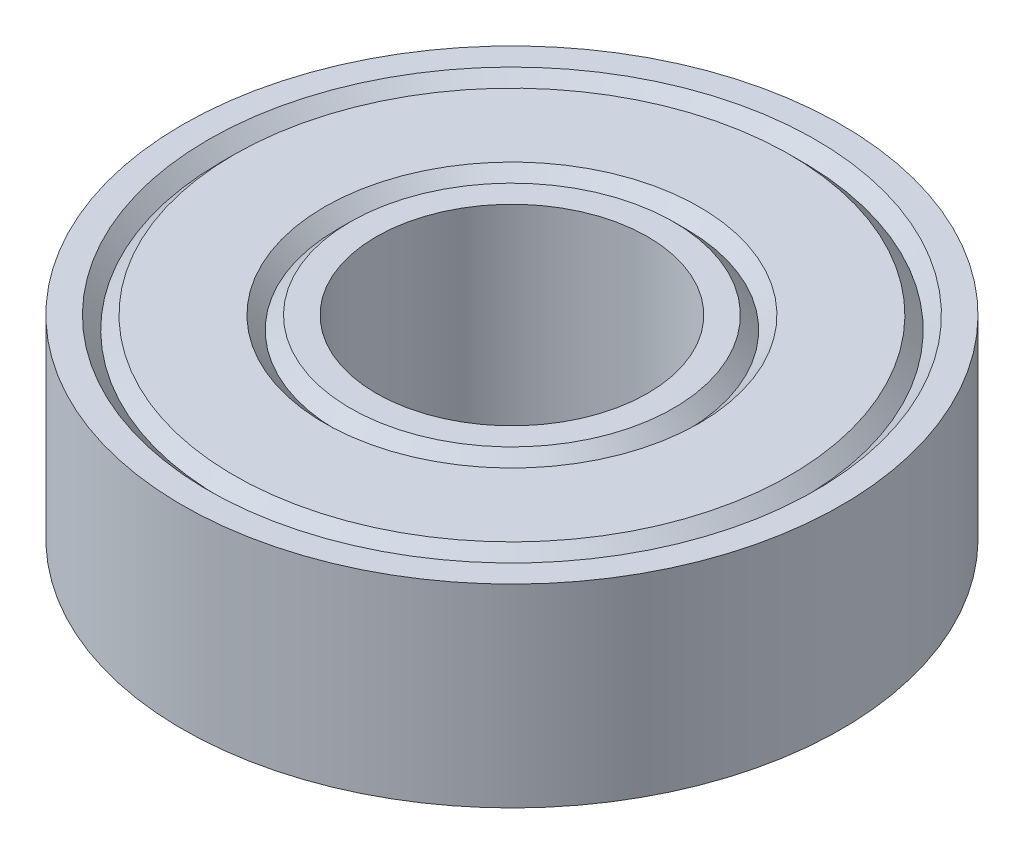
ISO-10303-21;
HEADER;
FILE_DESCRIPTION(('STEP AP214'),'2;1');
FILE_NAME('part.step','',(''),(''),'','','');
FILE_SCHEMA(('AUTOMOTIVE_DESIGN { 1 0 10303 214 1 1 1 1 }'));
ENDSEC;
DATA;
#1=APPLICATION_CONTEXT('core data for automotive mechanical design processes');
#2=APPLICATION_PROTOCOL_DEFINITION('international standard','automotive_design',2000,#1);
#3=PRODUCT_CONTEXT('',#1,'mechanical');
#4=PRODUCT('Part','Part','',(#3));
#5=PRODUCT_RELATED_PRODUCT_CATEGORY('part','',(#4));
#6=PRODUCT_DEFINITION_FORMATION('','',#4);
#7=PRODUCT_DEFINITION_CONTEXT('part definition',#1,'design');
#8=PRODUCT_DEFINITION('design','',#6,#7);
#9=PRODUCT_DEFINITION_SHAPE('','',#8);
#10=(LENGTH_UNIT() NAMED_UNIT(*) SI_UNIT(.MILLI.,.METRE.));
#11=(NAMED_UNIT(*) PLANE_ANGLE_UNIT() SI_UNIT($,.RADIAN.));
#12=(NAMED_UNIT(*) SI_UNIT($,.STERADIAN.) SOLID_ANGLE_UNIT());
#13=UNCERTAINTY_MEASURE_WITH_UNIT(LENGTH_MEASURE(1.E-05),#10,'distance_accuracy_value','');
#14=(GEOMETRIC_REPRESENTATION_CONTEXT(3) GLOBAL_UNCERTAINTY_ASSIGNED_CONTEXT((#13)) GLOBAL_UNIT_ASSIGNED_CONTEXT((#10,
#11,#12)) REPRESENTATION_CONTEXT('',''));
#15=CARTESIAN_POINT('',(0.,0.,0.));
#16=DIRECTION('',(0.,0.,1.));
#17=DIRECTION('',(1.,0.,0.));
#18=AXIS2_PLACEMENT_3D('',#15,#16,#17);
#19=CARTESIAN_POINT('',(0.,2.5,0.));
#20=DIRECTION('',(0.,1.,0.));
#21=DIRECTION('',(-1.,0.,0.));
#22=AXIS2_PLACEMENT_3D('',#19,#20,#21);
#23=CYLINDRICAL_SURFACE('',#22,3.5);
#24=CARTESIAN_POINT('',(0.,2.49999999999999,0.));
#25=DIRECTION('',(0.,1.,0.));
#26=DIRECTION('',(-1.,0.,0.));
#27=AXIS2_PLACEMENT_3D('',#24,#25,#26);
#28=CIRCLE('',#27,3.5);
#29=CARTESIAN_POINT('',(-3.5,2.49999999999999,0.));
#30=VERTEX_POINT('',#29);
#31=EDGE_CURVE('E83',#30,#30,#28,.T.);
#32=ORIENTED_EDGE('',*,*,#31,.T.);
#33=EDGE_LOOP('',(#32));
#34=FACE_BOUND('',#33,.T.);
#35=CARTESIAN_POINT('',(0.,-2.49999999999999,0.));
#36=DIRECTION('',(0.,1.,0.));
#37=DIRECTION('',(-1.,0.,0.));
#38=AXIS2_PLACEMENT_3D('',#35,#36,#37);
#39=CIRCLE('',#38,3.5);
#40=CARTESIAN_POINT('',(-3.5,-2.49999999999999,0.));
#41=VERTEX_POINT('',#40);
#42=EDGE_CURVE('E10',#41,#41,#39,.T.);
#43=ORIENTED_EDGE('',*,*,#42,.F.);
#44=EDGE_LOOP('',(#43));
#45=FACE_BOUND('',#44,.T.);
#46=ADVANCED_FACE('F31',(#34,#45),#23,.F.);
#47=CARTESIAN_POINT('',(-3.5,-2.5,0.));
#48=DIRECTION('',(0.,-1.,0.));
#49=DIRECTION('',(1.,0.,0.));
#50=AXIS2_PLACEMENT_3D('',#47,#48,#49);
#51=PLANE('',#50);
#52=ORIENTED_EDGE('',*,*,#42,.T.);
#53=EDGE_LOOP('',(#52));
#54=FACE_BOUND('',#53,.T.);
#55=CARTESIAN_POINT('',(0.,-2.5,0.));
#56=DIRECTION('',(0.,1.,0.));
#57=DIRECTION('',(-1.,0.,0.));
#58=AXIS2_PLACEMENT_3D('',#55,#56,#57);
#59=CIRCLE('',#58,4.16666666666667);
#60=CARTESIAN_POINT('',(-4.16666666666667,-2.5,0.));
#61=VERTEX_POINT('',#60);
#62=EDGE_CURVE('E37',#61,#61,#59,.T.);
#63=ORIENTED_EDGE('',*,*,#62,.F.);
#64=EDGE_LOOP('',(#63));
#65=FACE_BOUND('',#64,.T.);
#66=ADVANCED_FACE('F101',(#54,#65),#51,.T.);
#67=CARTESIAN_POINT('',(0.,-2.16666666666667,0.));
#68=DIRECTION('',(0.,1.,0.));
#69=DIRECTION('',(-1.,0.,0.));
#70=AXIS2_PLACEMENT_3D('',#67,#68,#69);
#71=CONICAL_SURFACE('',#70,4.50000000000001,0.785398163397448);
#72=ORIENTED_EDGE('',*,*,#62,.T.);
#73=EDGE_LOOP('',(#72));
#74=FACE_BOUND('',#73,.T.);
#75=CARTESIAN_POINT('',(0.,-2.16666666666667,0.));
#76=DIRECTION('',(0.,1.,0.));
#77=DIRECTION('',(-1.,0.,0.));
#78=AXIS2_PLACEMENT_3D('',#75,#76,#77);
#79=CIRCLE('',#78,4.50000000000001);
#80=CARTESIAN_POINT('',(-4.50000000000001,-2.16666666666666,0.));
#81=VERTEX_POINT('',#80);
#82=EDGE_CURVE('E41',#81,#81,#79,.T.);
#83=ORIENTED_EDGE('',*,*,#82,.F.);
#84=EDGE_LOOP('',(#83));
#85=FACE_BOUND('',#84,.T.);
#86=ADVANCED_FACE('F105',(#74,#85),#71,.T.);
#87=CARTESIAN_POINT('',(0.,-2.5,0.));
#88=DIRECTION('',(0.,-1.,0.));
#89=DIRECTION('',(1.,0.,0.));
#90=AXIS2_PLACEMENT_3D('',#87,#88,#89);
#91=CONICAL_SURFACE('',#90,4.83333333333334,0.78539816339745);
#92=ORIENTED_EDGE('',*,*,#82,.T.);
#93=EDGE_LOOP('',(#92));
#94=FACE_BOUND('',#93,.T.);
#95=CARTESIAN_POINT('',(0.,-2.5,0.));
#96=DIRECTION('',(0.,1.,0.));
#97=DIRECTION('',(-1.,0.,0.));
#98=AXIS2_PLACEMENT_3D('',#95,#96,#97);
#99=CIRCLE('',#98,4.83333333333334);
#100=CARTESIAN_POINT('',(-4.83333333333334,-2.5,0.));
#101=VERTEX_POINT('',#100);
#102=EDGE_CURVE('E45',#101,#101,#99,.T.);
#103=ORIENTED_EDGE('',*,*,#102,.F.);
#104=EDGE_LOOP('',(#103));
#105=FACE_BOUND('',#104,.T.);
#106=ADVANCED_FACE('F109',(#94,#105),#91,.F.);
#107=CARTESIAN_POINT('',(-4.83333333333334,-2.5,0.));
#108=DIRECTION('',(0.,-1.,0.));
#109=DIRECTION('',(1.,0.,0.));
#110=AXIS2_PLACEMENT_3D('',#107,#108,#109);
#111=PLANE('',#110);
#112=ORIENTED_EDGE('',*,*,#102,.T.);
#113=EDGE_LOOP('',(#112));
#114=FACE_BOUND('',#113,.T.);
#115=CARTESIAN_POINT('',(0.,-2.50000000000001,0.));
#116=DIRECTION('',(0.,1.,0.));
#117=DIRECTION('',(-1.,0.,0.));
#118=AXIS2_PLACEMENT_3D('',#115,#116,#117);
#119=CIRCLE('',#118,7.16666666666666);
#120=CARTESIAN_POINT('',(-7.16666666666666,-2.5,0.));
#121=VERTEX_POINT('',#120);
#122=EDGE_CURVE('E50',#121,#121,#119,.T.);
#123=ORIENTED_EDGE('',*,*,#122,.F.);
#124=EDGE_LOOP('',(#123));
#125=FACE_BOUND('',#124,.T.);
#126=ADVANCED_FACE('F115',(#114,#125),#111,.T.);
#127=CARTESIAN_POINT('',(0.,-2.16666666666667,0.));
#128=DIRECTION('',(0.,1.,0.));
#129=DIRECTION('',(-1.,0.,0.));
#130=AXIS2_PLACEMENT_3D('',#127,#128,#129);
#131=CONICAL_SURFACE('',#130,7.5,0.785398163397455);
#132=ORIENTED_EDGE('',*,*,#122,.T.);
#133=EDGE_LOOP('',(#132));
#134=FACE_BOUND('',#133,.T.);
#135=CARTESIAN_POINT('',(0.,-2.16666666666667,0.));
#136=DIRECTION('',(0.,1.,0.));
#137=DIRECTION('',(-1.,0.,0.));
#138=AXIS2_PLACEMENT_3D('',#135,#136,#137);
#139=CIRCLE('',#138,7.5);
#140=CARTESIAN_POINT('',(-7.5,-2.16666666666666,0.));
#141=VERTEX_POINT('',#140);
#142=EDGE_CURVE('E53',#141,#141,#139,.T.);
#143=ORIENTED_EDGE('',*,*,#142,.F.);
#144=EDGE_LOOP('',(#143));
#145=FACE_BOUND('',#144,.T.);
#146=ADVANCED_FACE('F119',(#134,#145),#131,.T.);
#147=CARTESIAN_POINT('',(0.,-2.5,0.));
#148=DIRECTION('',(0.,-1.,0.));
#149=DIRECTION('',(1.,0.,0.));
#150=AXIS2_PLACEMENT_3D('',#147,#148,#149);
#151=CONICAL_SURFACE('',#150,7.83333333333333,0.785398163397446);
#152=ORIENTED_EDGE('',*,*,#142,.T.);
#153=EDGE_LOOP('',(#152));
#154=FACE_BOUND('',#153,.T.);
#155=CARTESIAN_POINT('',(0.,-2.5,0.));
#156=DIRECTION('',(0.,1.,0.));
#157=DIRECTION('',(-1.,0.,0.));
#158=AXIS2_PLACEMENT_3D('',#155,#156,#157);
#159=CIRCLE('',#158,7.83333333333334);
#160=CARTESIAN_POINT('',(-7.83333333333334,-2.5,0.));
#161=VERTEX_POINT('',#160);
#162=EDGE_CURVE('E56',#161,#161,#159,.T.);
#163=ORIENTED_EDGE('',*,*,#162,.F.);
#164=EDGE_LOOP('',(#163));
#165=FACE_BOUND('',#164,.T.);
#166=ADVANCED_FACE('F123',(#154,#165),#151,.F.);
#167=CARTESIAN_POINT('',(-7.83333333333334,-2.5,0.));
#168=DIRECTION('',(0.,-1.,0.));
#169=DIRECTION('',(1.,0.,0.));
#170=AXIS2_PLACEMENT_3D('',#167,#168,#169);
#171=PLANE('',#170);
#172=ORIENTED_EDGE('',*,*,#162,.T.);
#173=EDGE_LOOP('',(#172));
#174=FACE_BOUND('',#173,.T.);
#175=CARTESIAN_POINT('',(0.,-2.5,0.));
#176=DIRECTION('',(0.,1.,0.));
#177=DIRECTION('',(-1.,0.,0.));
#178=AXIS2_PLACEMENT_3D('',#175,#176,#177);
#179=CIRCLE('',#178,8.5);
#180=CARTESIAN_POINT('',(-8.5,-2.5,0.));
#181=VERTEX_POINT('',#180);
#182=EDGE_CURVE('E59',#181,#181,#179,.T.);
#183=ORIENTED_EDGE('',*,*,#182,.F.);
#184=EDGE_LOOP('',(#183));
#185=FACE_BOUND('',#184,.T.);
#186=ADVANCED_FACE('F127',(#174,#185),#171,.T.);
#187=CARTESIAN_POINT('',(0.,2.5,0.));
#188=DIRECTION('',(0.,1.,0.));
#189=DIRECTION('',(-1.,0.,0.));
#190=AXIS2_PLACEMENT_3D('',#187,#188,#189);
#191=CYLINDRICAL_SURFACE('',#190,8.5);
#192=ORIENTED_EDGE('',*,*,#182,.T.);
#193=EDGE_LOOP('',(#192));
#194=FACE_BOUND('',#193,.T.);
#195=CARTESIAN_POINT('',(0.,2.5,0.));
#196=DIRECTION('',(0.,1.,0.));
#197=DIRECTION('',(-1.,0.,0.));
#198=AXIS2_PLACEMENT_3D('',#195,#196,#197);
#199=CIRCLE('',#198,8.5);
#200=CARTESIAN_POINT('',(-8.5,2.5,0.));
#201=VERTEX_POINT('',#200);
#202=EDGE_CURVE('E62',#201,#201,#199,.T.);
#203=ORIENTED_EDGE('',*,*,#202,.F.);
#204=EDGE_LOOP('',(#203));
#205=FACE_BOUND('',#204,.T.);
#206=ADVANCED_FACE('F131',(#194,#205),#191,.T.);
#207=CARTESIAN_POINT('',(-7.83333333333334,2.5,0.));
#208=DIRECTION('',(0.,1.,0.));
#209=DIRECTION('',(-1.,0.,0.));
#210=AXIS2_PLACEMENT_3D('',#207,#208,#209);
#211=PLANE('',#210);
#212=ORIENTED_EDGE('',*,*,#202,.T.);
#213=EDGE_LOOP('',(#212));
#214=FACE_BOUND('',#213,.T.);
#215=CARTESIAN_POINT('',(0.,2.5,0.));
#216=DIRECTION('',(0.,1.,0.));
#217=DIRECTION('',(-1.,0.,0.));
#218=AXIS2_PLACEMENT_3D('',#215,#216,#217);
#219=CIRCLE('',#218,7.83333333333334);
#220=CARTESIAN_POINT('',(-7.83333333333334,2.5,0.));
#221=VERTEX_POINT('',#220);
#222=EDGE_CURVE('E65',#221,#221,#219,.T.);
#223=ORIENTED_EDGE('',*,*,#222,.F.);
#224=EDGE_LOOP('',(#223));
#225=FACE_BOUND('',#224,.T.);
#226=ADVANCED_FACE('F135',(#214,#225),#211,.T.);
#227=CARTESIAN_POINT('',(0.,2.16666666666666,0.));
#228=DIRECTION('',(0.,1.,0.));
#229=DIRECTION('',(-1.,0.,0.));
#230=AXIS2_PLACEMENT_3D('',#227,#228,#229);
#231=CONICAL_SURFACE('',#230,7.5,0.785398163397452);
#232=ORIENTED_EDGE('',*,*,#222,.T.);
#233=EDGE_LOOP('',(#232));
#234=FACE_BOUND('',#233,.T.);
#235=CARTESIAN_POINT('',(0.,2.16666666666666,0.));
#236=DIRECTION('',(0.,1.,0.));
#237=DIRECTION('',(-1.,0.,0.));
#238=AXIS2_PLACEMENT_3D('',#235,#236,#237);
#239=CIRCLE('',#238,7.5);
#240=CARTESIAN_POINT('',(-7.5,2.16666666666666,0.));
#241=VERTEX_POINT('',#240);
#242=EDGE_CURVE('E68',#241,#241,#239,.T.);
#243=ORIENTED_EDGE('',*,*,#242,.F.);
#244=EDGE_LOOP('',(#243));
#245=FACE_BOUND('',#244,.T.);
#246=ADVANCED_FACE('F139',(#234,#245),#231,.F.);
#247=CARTESIAN_POINT('',(0.,2.5,0.));
#248=DIRECTION('',(0.,-1.,0.));
#249=DIRECTION('',(1.,0.,0.));
#250=AXIS2_PLACEMENT_3D('',#247,#248,#249);
#251=CONICAL_SURFACE('',#250,7.16666666666666,0.785398163397448);
#252=ORIENTED_EDGE('',*,*,#242,.T.);
#253=EDGE_LOOP('',(#252));
#254=FACE_BOUND('',#253,.T.);
#255=CARTESIAN_POINT('',(0.,2.5,0.));
#256=DIRECTION('',(0.,1.,0.));
#257=DIRECTION('',(-1.,0.,0.));
#258=AXIS2_PLACEMENT_3D('',#255,#256,#257);
#259=CIRCLE('',#258,7.16666666666666);
#260=CARTESIAN_POINT('',(-7.16666666666666,2.5,0.));
#261=VERTEX_POINT('',#260);
#262=EDGE_CURVE('E71',#261,#261,#259,.T.);
#263=ORIENTED_EDGE('',*,*,#262,.F.);
#264=EDGE_LOOP('',(#263));
#265=FACE_BOUND('',#264,.T.);
#266=ADVANCED_FACE('F143',(#254,#265),#251,.T.);
#267=CARTESIAN_POINT('',(-4.83333333333334,2.5,0.));
#268=DIRECTION('',(0.,1.,0.));
#269=DIRECTION('',(-1.,0.,0.));
#270=AXIS2_PLACEMENT_3D('',#267,#268,#269);
#271=PLANE('',#270);
#272=ORIENTED_EDGE('',*,*,#262,.T.);
#273=EDGE_LOOP('',(#272));
#274=FACE_BOUND('',#273,.T.);
#275=CARTESIAN_POINT('',(0.,2.5,0.));
#276=DIRECTION('',(0.,1.,0.));
#277=DIRECTION('',(-1.,0.,0.));
#278=AXIS2_PLACEMENT_3D('',#275,#276,#277);
#279=CIRCLE('',#278,4.83333333333334);
#280=CARTESIAN_POINT('',(-4.83333333333334,2.5,0.));
#281=VERTEX_POINT('',#280);
#282=EDGE_CURVE('E74',#281,#281,#279,.T.);
#283=ORIENTED_EDGE('',*,*,#282,.F.);
#284=EDGE_LOOP('',(#283));
#285=FACE_BOUND('',#284,.T.);
#286=ADVANCED_FACE('F147',(#274,#285),#271,.T.);
#287=CARTESIAN_POINT('',(0.,2.16666666666666,0.));
#288=DIRECTION('',(0.,1.,0.));
#289=DIRECTION('',(-1.,0.,0.));
#290=AXIS2_PLACEMENT_3D('',#287,#288,#289);
#291=CONICAL_SURFACE('',#290,4.50000000000001,0.78539816339745);
#292=ORIENTED_EDGE('',*,*,#282,.T.);
#293=EDGE_LOOP('',(#292));
#294=FACE_BOUND('',#293,.T.);
#295=CARTESIAN_POINT('',(0.,2.16666666666666,0.));
#296=DIRECTION('',(0.,1.,0.));
#297=DIRECTION('',(-1.,0.,0.));
#298=AXIS2_PLACEMENT_3D('',#295,#296,#297);
#299=CIRCLE('',#298,4.50000000000001);
#300=CARTESIAN_POINT('',(-4.50000000000001,2.16666666666666,0.));
#301=VERTEX_POINT('',#300);
#302=EDGE_CURVE('E77',#301,#301,#299,.T.);
#303=ORIENTED_EDGE('',*,*,#302,.F.);
#304=EDGE_LOOP('',(#303));
#305=FACE_BOUND('',#304,.T.);
#306=ADVANCED_FACE('F97',(#294,#305),#291,.F.);
#307=CARTESIAN_POINT('',(0.,2.5,0.));
#308=DIRECTION('',(0.,-1.,0.));
#309=DIRECTION('',(1.,0.,0.));
#310=AXIS2_PLACEMENT_3D('',#307,#308,#309);
#311=CONICAL_SURFACE('',#310,4.16666666666667,0.785398163397446);
#312=ORIENTED_EDGE('',*,*,#302,.T.);
#313=EDGE_LOOP('',(#312));
#314=FACE_BOUND('',#313,.T.);
#315=CARTESIAN_POINT('',(0.,2.5,0.));
#316=DIRECTION('',(0.,1.,0.));
#317=DIRECTION('',(-1.,0.,0.));
#318=AXIS2_PLACEMENT_3D('',#315,#316,#317);
#319=CIRCLE('',#318,4.16666666666667);
#320=CARTESIAN_POINT('',(-4.16666666666667,2.5,0.));
#321=VERTEX_POINT('',#320);
#322=EDGE_CURVE('E80',#321,#321,#319,.T.);
#323=ORIENTED_EDGE('',*,*,#322,.F.);
#324=EDGE_LOOP('',(#323));
#325=FACE_BOUND('',#324,.T.);
#326=ADVANCED_FACE('F91',(#314,#325),#311,.T.);
#327=CARTESIAN_POINT('',(-3.5,2.5,0.));
#328=DIRECTION('',(0.,1.,0.));
#329=DIRECTION('',(-1.,0.,0.));
#330=AXIS2_PLACEMENT_3D('',#327,#328,#329);
#331=PLANE('',#330);
#332=ORIENTED_EDGE('',*,*,#322,.T.);
#333=EDGE_LOOP('',(#332));
#334=FACE_BOUND('',#333,.T.);
#335=ORIENTED_EDGE('',*,*,#31,.F.);
#336=EDGE_LOOP('',(#335));
#337=FACE_BOUND('',#336,.T.);
#338=ADVANCED_FACE('F89',(#334,#337),#331,.T.);
#339=CLOSED_SHELL('',(#46,#66,#86,#106,#126,#146,#166,#186,#206,#226,#246,#266,#286,#306,#326,#338));
#340=MANIFOLD_SOLID_BREP('B2',#339);
#341=ADVANCED_BREP_SHAPE_REPRESENTATION('',(#18,#340),#14);
#342=SHAPE_DEFINITION_REPRESENTATION(#9,#341);
ENDSEC;
END-ISO-10303-21;
